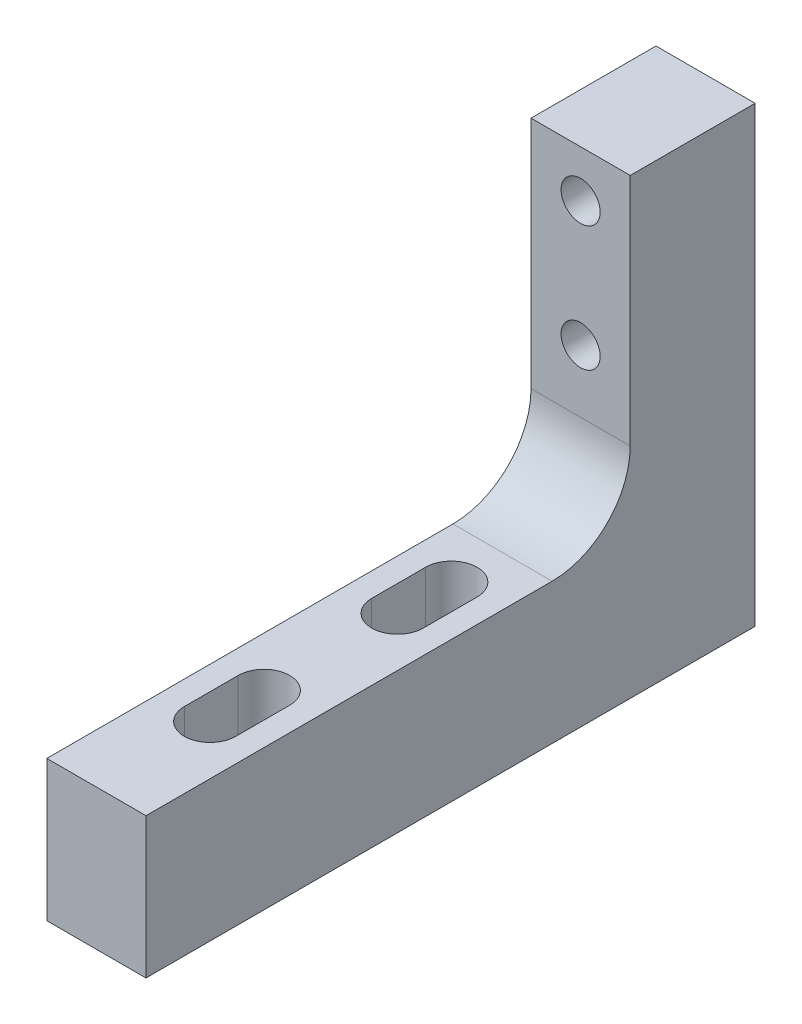
ISO-10303-21;
HEADER;
FILE_DESCRIPTION(('STEP AP214'),'2;1');
FILE_NAME('part.step','',(''),(''),'','','');
FILE_SCHEMA(('AUTOMOTIVE_DESIGN { 1 0 10303 214 1 1 1 1 }'));
ENDSEC;
DATA;
#1=APPLICATION_CONTEXT('core data for automotive mechanical design processes');
#2=APPLICATION_PROTOCOL_DEFINITION('international standard','automotive_design',2000,#1);
#3=PRODUCT_CONTEXT('',#1,'mechanical');
#4=PRODUCT('Part','Part','',(#3));
#5=PRODUCT_RELATED_PRODUCT_CATEGORY('part','',(#4));
#6=PRODUCT_DEFINITION_FORMATION('','',#4);
#7=PRODUCT_DEFINITION_CONTEXT('part definition',#1,'design');
#8=PRODUCT_DEFINITION('design','',#6,#7);
#9=PRODUCT_DEFINITION_SHAPE('','',#8);
#10=(LENGTH_UNIT() NAMED_UNIT(*) SI_UNIT(.MILLI.,.METRE.));
#11=(NAMED_UNIT(*) PLANE_ANGLE_UNIT() SI_UNIT($,.RADIAN.));
#12=(NAMED_UNIT(*) SI_UNIT($,.STERADIAN.) SOLID_ANGLE_UNIT());
#13=UNCERTAINTY_MEASURE_WITH_UNIT(LENGTH_MEASURE(1.E-05),#10,'distance_accuracy_value','');
#14=(GEOMETRIC_REPRESENTATION_CONTEXT(3) GLOBAL_UNCERTAINTY_ASSIGNED_CONTEXT((#13)) GLOBAL_UNIT_ASSIGNED_CONTEXT((#10,
#11,#12)) REPRESENTATION_CONTEXT('',''));
#15=CARTESIAN_POINT('',(0.,0.,0.));
#16=DIRECTION('',(0.,0.,1.));
#17=DIRECTION('',(1.,0.,0.));
#18=AXIS2_PLACEMENT_3D('',#15,#16,#17);
#19=CARTESIAN_POINT('',(6.35,18.,0.));
#20=DIRECTION('',(0.,0.,-1.));
#21=DIRECTION('',(0.,1.,0.));
#22=AXIS2_PLACEMENT_3D('',#19,#20,#21);
#23=PLANE('',#22);
#24=DIRECTION('',(0.,-1.,0.));
#25=VECTOR('',#24,1.);
#26=CARTESIAN_POINT('',(-6.35,18.,0.));
#27=LINE('',#26,#25);
#28=CARTESIAN_POINT('',(-6.35,18.,0.));
#29=VERTEX_POINT('',#28);
#30=CARTESIAN_POINT('',(-6.35,0.,0.));
#31=VERTEX_POINT('',#30);
#32=EDGE_CURVE('E235',#29,#31,#27,.T.);
#33=ORIENTED_EDGE('',*,*,#32,.T.);
#34=DIRECTION('',(-1.,0.,0.));
#35=VECTOR('',#34,1.);
#36=CARTESIAN_POINT('',(6.35,0.,0.));
#37=LINE('',#36,#35);
#38=CARTESIAN_POINT('',(6.35,0.,0.));
#39=VERTEX_POINT('',#38);
#40=EDGE_CURVE('E11',#39,#31,#37,.T.);
#41=ORIENTED_EDGE('',*,*,#40,.F.);
#42=DIRECTION('',(0.,-1.,0.));
#43=VECTOR('',#42,1.);
#44=CARTESIAN_POINT('',(6.35,18.,0.));
#45=LINE('',#44,#43);
#46=CARTESIAN_POINT('',(6.35,18.,0.));
#47=VERTEX_POINT('',#46);
#48=EDGE_CURVE('E236',#47,#39,#45,.T.);
#49=ORIENTED_EDGE('',*,*,#48,.F.);
#50=DIRECTION('',(-1.,0.,0.));
#51=VECTOR('',#50,1.);
#52=CARTESIAN_POINT('',(6.35,18.,0.));
#53=LINE('',#52,#51);
#54=EDGE_CURVE('E252',#47,#29,#53,.T.);
#55=ORIENTED_EDGE('',*,*,#54,.T.);
#56=EDGE_LOOP('',(#33,#41,#49,#55));
#57=FACE_BOUND('',#56,.T.);
#58=ADVANCED_FACE('F40',(#57),#23,.F.);
#59=CARTESIAN_POINT('',(6.35,0.,0.));
#60=DIRECTION('',(0.,1.,0.));
#61=DIRECTION('',(0.,0.,1.));
#62=AXIS2_PLACEMENT_3D('',#59,#60,#61);
#63=PLANE('',#62);
#64=DIRECTION('',(0.,0.,-1.));
#65=VECTOR('',#64,1.);
#66=CARTESIAN_POINT('',(3.3,0.,-21.45));
#67=LINE('',#66,#65);
#68=CARTESIAN_POINT('',(3.30000000000001,0.,-14.55));
#69=VERTEX_POINT('',#68);
#70=CARTESIAN_POINT('',(3.3,0.,-21.45));
#71=VERTEX_POINT('',#70);
#72=EDGE_CURVE('E157',#69,#71,#67,.T.);
#73=ORIENTED_EDGE('',*,*,#72,.T.);
#74=CARTESIAN_POINT('',(0.,0.,-21.45));
#75=DIRECTION('',(0.,1.,0.));
#76=DIRECTION('',(0.,0.,1.));
#77=AXIS2_PLACEMENT_3D('',#74,#75,#76);
#78=CIRCLE('',#77,3.30000000000001);
#79=CARTESIAN_POINT('',(-3.30000000000001,0.,-21.45));
#80=VERTEX_POINT('',#79);
#81=EDGE_CURVE('E151',#71,#80,#78,.T.);
#82=ORIENTED_EDGE('',*,*,#81,.T.);
#83=DIRECTION('',(0.,0.,1.));
#84=VECTOR('',#83,1.);
#85=CARTESIAN_POINT('',(-3.30000000000001,0.,-21.45));
#86=LINE('',#85,#84);
#87=CARTESIAN_POINT('',(-3.3,0.,-14.55));
#88=VERTEX_POINT('',#87);
#89=EDGE_CURVE('E160',#80,#88,#86,.T.);
#90=ORIENTED_EDGE('',*,*,#89,.T.);
#91=CARTESIAN_POINT('',(0.,0.,-14.55));
#92=DIRECTION('',(0.,1.,0.));
#93=DIRECTION('',(0.,0.,1.));
#94=AXIS2_PLACEMENT_3D('',#91,#92,#93);
#95=CIRCLE('',#94,3.30000000000001);
#96=EDGE_CURVE('E54',#88,#69,#95,.T.);
#97=ORIENTED_EDGE('',*,*,#96,.T.);
#98=EDGE_LOOP('',(#73,#82,#90,#97));
#99=FACE_BOUND('',#98,.T.);
#100=DIRECTION('',(0.,0.,-1.));
#101=VECTOR('',#100,1.);
#102=CARTESIAN_POINT('',(3.3,0.,-45.45));
#103=LINE('',#102,#101);
#104=CARTESIAN_POINT('',(3.3,0.,-38.55));
#105=VERTEX_POINT('',#104);
#106=CARTESIAN_POINT('',(3.3,0.,-45.45));
#107=VERTEX_POINT('',#106);
#108=EDGE_CURVE('E196',#105,#107,#103,.T.);
#109=ORIENTED_EDGE('',*,*,#108,.T.);
#110=CARTESIAN_POINT('',(0.,0.,-45.45));
#111=DIRECTION('',(0.,1.,0.));
#112=DIRECTION('',(0.,0.,1.));
#113=AXIS2_PLACEMENT_3D('',#110,#111,#112);
#114=CIRCLE('',#113,3.3);
#115=CARTESIAN_POINT('',(-3.3,0.,-45.45));
#116=VERTEX_POINT('',#115);
#117=EDGE_CURVE('E186',#107,#116,#114,.T.);
#118=ORIENTED_EDGE('',*,*,#117,.T.);
#119=DIRECTION('',(0.,0.,1.));
#120=VECTOR('',#119,1.);
#121=CARTESIAN_POINT('',(-3.3,0.,-45.45));
#122=LINE('',#121,#120);
#123=CARTESIAN_POINT('',(-3.3,0.,-38.55));
#124=VERTEX_POINT('',#123);
#125=EDGE_CURVE('E189',#116,#124,#122,.T.);
#126=ORIENTED_EDGE('',*,*,#125,.T.);
#127=CARTESIAN_POINT('',(0.,0.,-38.55));
#128=DIRECTION('',(0.,1.,0.));
#129=DIRECTION('',(0.,0.,1.));
#130=AXIS2_PLACEMENT_3D('',#127,#128,#129);
#131=CIRCLE('',#130,3.3);
#132=EDGE_CURVE('E193',#124,#105,#131,.T.);
#133=ORIENTED_EDGE('',*,*,#132,.T.);
#134=EDGE_LOOP('',(#109,#118,#126,#133));
#135=FACE_BOUND('',#134,.T.);
#136=DIRECTION('',(0.,0.,-1.));
#137=VECTOR('',#136,1.);
#138=CARTESIAN_POINT('',(-6.35,0.,0.));
#139=LINE('',#138,#137);
#140=CARTESIAN_POINT('',(-6.35,0.,-78.));
#141=VERTEX_POINT('',#140);
#142=EDGE_CURVE('E255',#31,#141,#139,.T.);
#143=ORIENTED_EDGE('',*,*,#142,.T.);
#144=DIRECTION('',(-1.,0.,0.));
#145=VECTOR('',#144,1.);
#146=CARTESIAN_POINT('',(6.35,0.,-78.));
#147=LINE('',#146,#145);
#148=CARTESIAN_POINT('',(6.35,0.,-78.));
#149=VERTEX_POINT('',#148);
#150=EDGE_CURVE('E47',#149,#141,#147,.T.);
#151=ORIENTED_EDGE('',*,*,#150,.F.);
#152=DIRECTION('',(0.,0.,-1.));
#153=VECTOR('',#152,1.);
#154=CARTESIAN_POINT('',(6.35,0.,0.));
#155=LINE('',#154,#153);
#156=EDGE_CURVE('E239',#39,#149,#155,.T.);
#157=ORIENTED_EDGE('',*,*,#156,.F.);
#158=ORIENTED_EDGE('',*,*,#40,.T.);
#159=EDGE_LOOP('',(#143,#151,#157,#158));
#160=FACE_BOUND('',#159,.T.);
#161=ADVANCED_FACE('F164',(#99,#135,#160),#63,.F.);
#162=CARTESIAN_POINT('',(6.35,0.,-78.));
#163=DIRECTION('',(0.,0.,1.));
#164=DIRECTION('',(1.,0.,0.));
#165=AXIS2_PLACEMENT_3D('',#162,#163,#164);
#166=PLANE('',#165);
#167=CARTESIAN_POINT('',(0.,52.,-78.));
#168=DIRECTION('',(0.,0.,-1.));
#169=DIRECTION('',(-1.,0.,0.));
#170=AXIS2_PLACEMENT_3D('',#167,#168,#169);
#171=CIRCLE('',#170,2.49999999999999);
#172=CARTESIAN_POINT('',(-2.49999999999999,52.,-78.));
#173=VERTEX_POINT('',#172);
#174=EDGE_CURVE('E211',#173,#173,#171,.T.);
#175=ORIENTED_EDGE('',*,*,#174,.F.);
#176=EDGE_LOOP('',(#175));
#177=FACE_BOUND('',#176,.T.);
#178=CARTESIAN_POINT('',(0.,9.,-78.));
#179=DIRECTION('',(0.,0.,-1.));
#180=DIRECTION('',(-1.,0.,0.));
#181=AXIS2_PLACEMENT_3D('',#178,#179,#180);
#182=CIRCLE('',#181,2.5);
#183=CARTESIAN_POINT('',(-2.5,9.,-78.));
#184=VERTEX_POINT('',#183);
#185=EDGE_CURVE('E223',#184,#184,#182,.T.);
#186=ORIENTED_EDGE('',*,*,#185,.F.);
#187=EDGE_LOOP('',(#186));
#188=FACE_BOUND('',#187,.T.);
#189=CARTESIAN_POINT('',(0.,36.,-78.));
#190=DIRECTION('',(0.,0.,-1.));
#191=DIRECTION('',(-1.,0.,0.));
#192=AXIS2_PLACEMENT_3D('',#189,#190,#191);
#193=CIRCLE('',#192,2.5);
#194=CARTESIAN_POINT('',(-2.5,36.,-78.));
#195=VERTEX_POINT('',#194);
#196=EDGE_CURVE('E229',#195,#195,#193,.T.);
#197=ORIENTED_EDGE('',*,*,#196,.F.);
#198=EDGE_LOOP('',(#197));
#199=FACE_BOUND('',#198,.T.);
#200=DIRECTION('',(0.,1.,0.));
#201=VECTOR('',#200,1.);
#202=CARTESIAN_POINT('',(-6.35,0.,-78.));
#203=LINE('',#202,#201);
#204=CARTESIAN_POINT('',(-6.35,58.,-78.));
#205=VERTEX_POINT('',#204);
#206=EDGE_CURVE('E257',#141,#205,#203,.T.);
#207=ORIENTED_EDGE('',*,*,#206,.T.);
#208=DIRECTION('',(-1.,0.,0.));
#209=VECTOR('',#208,1.);
#210=CARTESIAN_POINT('',(6.35,58.,-78.));
#211=LINE('',#210,#209);
#212=CARTESIAN_POINT('',(6.35,58.,-78.));
#213=VERTEX_POINT('',#212);
#214=EDGE_CURVE('E277',#213,#205,#211,.T.);
#215=ORIENTED_EDGE('',*,*,#214,.F.);
#216=DIRECTION('',(0.,1.,0.));
#217=VECTOR('',#216,1.);
#218=CARTESIAN_POINT('',(6.35,0.,-78.));
#219=LINE('',#218,#217);
#220=EDGE_CURVE('E242',#149,#213,#219,.T.);
#221=ORIENTED_EDGE('',*,*,#220,.F.);
#222=ORIENTED_EDGE('',*,*,#150,.T.);
#223=EDGE_LOOP('',(#207,#215,#221,#222));
#224=FACE_BOUND('',#223,.T.);
#225=ADVANCED_FACE('F284',(#177,#188,#199,#224),#166,.F.);
#226=CARTESIAN_POINT('',(6.35,58.,-78.));
#227=DIRECTION('',(0.,-1.,0.));
#228=DIRECTION('',(0.,0.,-1.));
#229=AXIS2_PLACEMENT_3D('',#226,#227,#228);
#230=PLANE('',#229);
#231=DIRECTION('',(0.,0.,1.));
#232=VECTOR('',#231,1.);
#233=CARTESIAN_POINT('',(-6.35,58.,-78.));
#234=LINE('',#233,#232);
#235=CARTESIAN_POINT('',(-6.35,58.,-62.));
#236=VERTEX_POINT('',#235);
#237=EDGE_CURVE('E259',#205,#236,#234,.T.);
#238=ORIENTED_EDGE('',*,*,#237,.T.);
#239=DIRECTION('',(-1.,0.,0.));
#240=VECTOR('',#239,1.);
#241=CARTESIAN_POINT('',(6.35,58.,-62.));
#242=LINE('',#241,#240);
#243=CARTESIAN_POINT('',(6.35,58.,-62.));
#244=VERTEX_POINT('',#243);
#245=EDGE_CURVE('E274',#244,#236,#242,.T.);
#246=ORIENTED_EDGE('',*,*,#245,.F.);
#247=DIRECTION('',(0.,0.,1.));
#248=VECTOR('',#247,1.);
#249=CARTESIAN_POINT('',(6.35,58.,-78.));
#250=LINE('',#249,#248);
#251=EDGE_CURVE('E244',#213,#244,#250,.T.);
#252=ORIENTED_EDGE('',*,*,#251,.F.);
#253=ORIENTED_EDGE('',*,*,#214,.T.);
#254=EDGE_LOOP('',(#238,#246,#252,#253));
#255=FACE_BOUND('',#254,.T.);
#256=ADVANCED_FACE('F295',(#255),#230,.F.);
#257=CARTESIAN_POINT('',(6.35,58.,-62.));
#258=DIRECTION('',(0.,0.,-1.));
#259=DIRECTION('',(0.,1.,0.));
#260=AXIS2_PLACEMENT_3D('',#257,#258,#259);
#261=PLANE('',#260);
#262=CARTESIAN_POINT('',(0.,52.,-62.));
#263=DIRECTION('',(0.,0.,-1.));
#264=DIRECTION('',(0.,1.,0.));
#265=AXIS2_PLACEMENT_3D('',#262,#263,#264);
#266=CIRCLE('',#265,2.49999999999999);
#267=CARTESIAN_POINT('',(0.,54.5,-62.));
#268=VERTEX_POINT('',#267);
#269=EDGE_CURVE('E220',#268,#268,#266,.T.);
#270=ORIENTED_EDGE('',*,*,#269,.T.);
#271=EDGE_LOOP('',(#270));
#272=FACE_BOUND('',#271,.T.);
#273=CARTESIAN_POINT('',(0.,36.,-62.));
#274=DIRECTION('',(0.,0.,-1.));
#275=DIRECTION('',(0.,1.,0.));
#276=AXIS2_PLACEMENT_3D('',#273,#274,#275);
#277=CIRCLE('',#276,2.5);
#278=CARTESIAN_POINT('',(0.,38.5,-62.));
#279=VERTEX_POINT('',#278);
#280=EDGE_CURVE('E232',#279,#279,#277,.T.);
#281=ORIENTED_EDGE('',*,*,#280,.T.);
#282=EDGE_LOOP('',(#281));
#283=FACE_BOUND('',#282,.T.);
#284=DIRECTION('',(0.,-1.,0.));
#285=VECTOR('',#284,1.);
#286=CARTESIAN_POINT('',(-6.35,58.,-62.));
#287=LINE('',#286,#285);
#288=CARTESIAN_POINT('',(-6.35,28.,-62.));
#289=VERTEX_POINT('',#288);
#290=EDGE_CURVE('E261',#236,#289,#287,.T.);
#291=ORIENTED_EDGE('',*,*,#290,.T.);
#292=DIRECTION('',(-1.,0.,0.));
#293=VECTOR('',#292,1.);
#294=CARTESIAN_POINT('',(6.35,28.,-62.));
#295=LINE('',#294,#293);
#296=CARTESIAN_POINT('',(6.35,28.,-62.));
#297=VERTEX_POINT('',#296);
#298=EDGE_CURVE('E271',#297,#289,#295,.T.);
#299=ORIENTED_EDGE('',*,*,#298,.F.);
#300=DIRECTION('',(0.,-1.,0.));
#301=VECTOR('',#300,1.);
#302=CARTESIAN_POINT('',(6.35,58.,-62.));
#303=LINE('',#302,#301);
#304=EDGE_CURVE('E246',#244,#297,#303,.T.);
#305=ORIENTED_EDGE('',*,*,#304,.F.);
#306=ORIENTED_EDGE('',*,*,#245,.T.);
#307=EDGE_LOOP('',(#291,#299,#305,#306));
#308=FACE_BOUND('',#307,.T.);
#309=ADVANCED_FACE('F299',(#272,#283,#308),#261,.F.);
#310=CARTESIAN_POINT('',(6.35,28.,-52.));
#311=DIRECTION('',(-1.,0.,0.));
#312=DIRECTION('',(0.,0.,1.));
#313=AXIS2_PLACEMENT_3D('',#310,#311,#312);
#314=CYLINDRICAL_SURFACE('',#313,9.99999999999999);
#315=CARTESIAN_POINT('',(-6.35,28.,-52.));
#316=DIRECTION('',(-1.,0.,0.));
#317=DIRECTION('',(0.,0.,1.));
#318=AXIS2_PLACEMENT_3D('',#315,#316,#317);
#319=CIRCLE('',#318,9.99999999999999);
#320=CARTESIAN_POINT('',(-6.35,18.,-52.));
#321=VERTEX_POINT('',#320);
#322=EDGE_CURVE('E263',#289,#321,#319,.T.);
#323=ORIENTED_EDGE('',*,*,#322,.T.);
#324=DIRECTION('',(-1.,0.,0.));
#325=VECTOR('',#324,1.);
#326=CARTESIAN_POINT('',(6.35,18.,-52.));
#327=LINE('',#326,#325);
#328=CARTESIAN_POINT('',(6.35,18.,-52.));
#329=VERTEX_POINT('',#328);
#330=EDGE_CURVE('E268',#329,#321,#327,.T.);
#331=ORIENTED_EDGE('',*,*,#330,.F.);
#332=CARTESIAN_POINT('',(6.35,28.,-52.));
#333=DIRECTION('',(-1.,0.,0.));
#334=DIRECTION('',(0.,0.,1.));
#335=AXIS2_PLACEMENT_3D('',#332,#333,#334);
#336=CIRCLE('',#335,9.99999999999999);
#337=EDGE_CURVE('E248',#297,#329,#336,.T.);
#338=ORIENTED_EDGE('',*,*,#337,.F.);
#339=ORIENTED_EDGE('',*,*,#298,.T.);
#340=EDGE_LOOP('',(#323,#331,#338,#339));
#341=FACE_BOUND('',#340,.T.);
#342=ADVANCED_FACE('F314',(#341),#314,.F.);
#343=CARTESIAN_POINT('',(6.35,18.,-52.));
#344=DIRECTION('',(0.,-1.,0.));
#345=DIRECTION('',(0.,0.,-1.));
#346=AXIS2_PLACEMENT_3D('',#343,#344,#345);
#347=PLANE('',#346);
#348=DIRECTION('',(0.,0.,1.));
#349=VECTOR('',#348,1.);
#350=CARTESIAN_POINT('',(-3.30000000000001,18.,-21.45));
#351=LINE('',#350,#349);
#352=CARTESIAN_POINT('',(-3.30000000000001,18.,-21.45));
#353=VERTEX_POINT('',#352);
#354=CARTESIAN_POINT('',(-3.3,18.,-14.55));
#355=VERTEX_POINT('',#354);
#356=EDGE_CURVE('E176',#353,#355,#351,.T.);
#357=ORIENTED_EDGE('',*,*,#356,.F.);
#358=CARTESIAN_POINT('',(0.,18.,-21.45));
#359=DIRECTION('',(0.,1.,0.));
#360=DIRECTION('',(0.,0.,1.));
#361=AXIS2_PLACEMENT_3D('',#358,#359,#360);
#362=CIRCLE('',#361,3.30000000000001);
#363=CARTESIAN_POINT('',(3.3,18.,-21.45));
#364=VERTEX_POINT('',#363);
#365=EDGE_CURVE('E62',#364,#353,#362,.T.);
#366=ORIENTED_EDGE('',*,*,#365,.F.);
#367=DIRECTION('',(0.,0.,-1.));
#368=VECTOR('',#367,1.);
#369=CARTESIAN_POINT('',(3.3,18.,-21.45));
#370=LINE('',#369,#368);
#371=CARTESIAN_POINT('',(3.30000000000001,18.,-14.55));
#372=VERTEX_POINT('',#371);
#373=EDGE_CURVE('E167',#372,#364,#370,.T.);
#374=ORIENTED_EDGE('',*,*,#373,.F.);
#375=CARTESIAN_POINT('',(0.,18.,-14.55));
#376=DIRECTION('',(0.,1.,0.));
#377=DIRECTION('',(0.,0.,1.));
#378=AXIS2_PLACEMENT_3D('',#375,#376,#377);
#379=CIRCLE('',#378,3.30000000000001);
#380=EDGE_CURVE('E170',#355,#372,#379,.T.);
#381=ORIENTED_EDGE('',*,*,#380,.F.);
#382=EDGE_LOOP('',(#357,#366,#374,#381));
#383=FACE_BOUND('',#382,.T.);
#384=DIRECTION('',(0.,0.,1.));
#385=VECTOR('',#384,1.);
#386=CARTESIAN_POINT('',(-3.3,18.,-45.45));
#387=LINE('',#386,#385);
#388=CARTESIAN_POINT('',(-3.3,18.,-45.45));
#389=VERTEX_POINT('',#388);
#390=CARTESIAN_POINT('',(-3.3,18.,-38.55));
#391=VERTEX_POINT('',#390);
#392=EDGE_CURVE('E201',#389,#391,#387,.T.);
#393=ORIENTED_EDGE('',*,*,#392,.F.);
#394=CARTESIAN_POINT('',(0.,18.,-45.45));
#395=DIRECTION('',(0.,1.,0.));
#396=DIRECTION('',(0.,0.,1.));
#397=AXIS2_PLACEMENT_3D('',#394,#395,#396);
#398=CIRCLE('',#397,3.3);
#399=CARTESIAN_POINT('',(3.3,18.,-45.45));
#400=VERTEX_POINT('',#399);
#401=EDGE_CURVE('E182',#400,#389,#398,.T.);
#402=ORIENTED_EDGE('',*,*,#401,.F.);
#403=DIRECTION('',(0.,0.,-1.));
#404=VECTOR('',#403,1.);
#405=CARTESIAN_POINT('',(3.3,18.,-45.45));
#406=LINE('',#405,#404);
#407=CARTESIAN_POINT('',(3.3,18.,-38.55));
#408=VERTEX_POINT('',#407);
#409=EDGE_CURVE('E190',#408,#400,#406,.T.);
#410=ORIENTED_EDGE('',*,*,#409,.F.);
#411=CARTESIAN_POINT('',(0.,18.,-38.55));
#412=DIRECTION('',(0.,1.,0.));
#413=DIRECTION('',(0.,0.,1.));
#414=AXIS2_PLACEMENT_3D('',#411,#412,#413);
#415=CIRCLE('',#414,3.3);
#416=EDGE_CURVE('E204',#391,#408,#415,.T.);
#417=ORIENTED_EDGE('',*,*,#416,.F.);
#418=EDGE_LOOP('',(#393,#402,#410,#417));
#419=FACE_BOUND('',#418,.T.);
#420=DIRECTION('',(0.,0.,1.));
#421=VECTOR('',#420,1.);
#422=CARTESIAN_POINT('',(-6.35,18.,-52.));
#423=LINE('',#422,#421);
#424=EDGE_CURVE('E240',#321,#29,#423,.T.);
#425=ORIENTED_EDGE('',*,*,#424,.T.);
#426=ORIENTED_EDGE('',*,*,#54,.F.);
#427=DIRECTION('',(0.,0.,1.));
#428=VECTOR('',#427,1.);
#429=CARTESIAN_POINT('',(6.35,18.,-52.));
#430=LINE('',#429,#428);
#431=EDGE_CURVE('E250',#329,#47,#430,.T.);
#432=ORIENTED_EDGE('',*,*,#431,.F.);
#433=ORIENTED_EDGE('',*,*,#330,.T.);
#434=EDGE_LOOP('',(#425,#426,#432,#433));
#435=FACE_BOUND('',#434,.T.);
#436=ADVANCED_FACE('F311',(#383,#419,#435),#347,.F.);
#437=CARTESIAN_POINT('',(6.35,28.,-52.));
#438=DIRECTION('',(-1.,0.,0.));
#439=DIRECTION('',(0.,0.,1.));
#440=AXIS2_PLACEMENT_3D('',#437,#438,#439);
#441=PLANE('',#440);
#442=ORIENTED_EDGE('',*,*,#48,.T.);
#443=ORIENTED_EDGE('',*,*,#156,.T.);
#444=ORIENTED_EDGE('',*,*,#220,.T.);
#445=ORIENTED_EDGE('',*,*,#251,.T.);
#446=ORIENTED_EDGE('',*,*,#304,.T.);
#447=ORIENTED_EDGE('',*,*,#337,.T.);
#448=ORIENTED_EDGE('',*,*,#431,.T.);
#449=EDGE_LOOP('',(#442,#443,#444,#445,#446,#447,#448));
#450=FACE_BOUND('',#449,.T.);
#451=ADVANCED_FACE('F303',(#450),#441,.F.);
#452=CARTESIAN_POINT('',(-6.35,28.,-52.));
#453=DIRECTION('',(-1.,0.,0.));
#454=DIRECTION('',(0.,0.,1.));
#455=AXIS2_PLACEMENT_3D('',#452,#453,#454);
#456=PLANE('',#455);
#457=ORIENTED_EDGE('',*,*,#32,.F.);
#458=ORIENTED_EDGE('',*,*,#424,.F.);
#459=ORIENTED_EDGE('',*,*,#322,.F.);
#460=ORIENTED_EDGE('',*,*,#290,.F.);
#461=ORIENTED_EDGE('',*,*,#237,.F.);
#462=ORIENTED_EDGE('',*,*,#206,.F.);
#463=ORIENTED_EDGE('',*,*,#142,.F.);
#464=EDGE_LOOP('',(#457,#458,#459,#460,#461,#462,#463));
#465=FACE_BOUND('',#464,.T.);
#466=ADVANCED_FACE('F290',(#465),#456,.T.);
#467=CARTESIAN_POINT('',(0.,36.,-78.));
#468=DIRECTION('',(0.,0.,-1.));
#469=DIRECTION('',(-1.,0.,0.));
#470=AXIS2_PLACEMENT_3D('',#467,#468,#469);
#471=CYLINDRICAL_SURFACE('',#470,2.5);
#472=ORIENTED_EDGE('',*,*,#196,.T.);
#473=EDGE_LOOP('',(#472));
#474=FACE_BOUND('',#473,.T.);
#475=ORIENTED_EDGE('',*,*,#280,.F.);
#476=EDGE_LOOP('',(#475));
#477=FACE_BOUND('',#476,.T.);
#478=ADVANCED_FACE('F461',(#474,#477),#471,.F.);
#479=CARTESIAN_POINT('',(0.,9.,-52.6));
#480=DIRECTION('',(0.,0.,-1.));
#481=DIRECTION('',(-1.,0.,0.));
#482=AXIS2_PLACEMENT_3D('',#479,#480,#481);
#483=CONICAL_SURFACE('',#482,2.49999999999999,1.02974425867665);
#484=CARTESIAN_POINT('',(0.,9.,-51.0978484524311));
#485=VERTEX_POINT('',#484);
#486=VERTEX_LOOP('',#485);
#487=FACE_BOUND('',#486,.T.);
#488=CARTESIAN_POINT('',(0.,9.,-52.6));
#489=DIRECTION('',(0.,0.,-1.));
#490=DIRECTION('',(-1.,0.,0.));
#491=AXIS2_PLACEMENT_3D('',#488,#489,#490);
#492=CIRCLE('',#491,2.49999999999999);
#493=CARTESIAN_POINT('',(-2.49999999999999,9.,-52.6));
#494=VERTEX_POINT('',#493);
#495=EDGE_CURVE('E226',#494,#494,#492,.T.);
#496=ORIENTED_EDGE('',*,*,#495,.T.);
#497=EDGE_LOOP('',(#496));
#498=FACE_BOUND('',#497,.T.);
#499=ADVANCED_FACE('F457',(#487,#498),#483,.F.);
#500=CARTESIAN_POINT('',(0.,9.,-78.));
#501=DIRECTION('',(0.,0.,-1.));
#502=DIRECTION('',(-1.,0.,0.));
#503=AXIS2_PLACEMENT_3D('',#500,#501,#502);
#504=CYLINDRICAL_SURFACE('',#503,2.5);
#505=ORIENTED_EDGE('',*,*,#495,.F.);
#506=EDGE_LOOP('',(#505));
#507=FACE_BOUND('',#506,.T.);
#508=ORIENTED_EDGE('',*,*,#185,.T.);
#509=EDGE_LOOP('',(#508));
#510=FACE_BOUND('',#509,.T.);
#511=ADVANCED_FACE('F359',(#507,#510),#504,.F.);
#512=CARTESIAN_POINT('',(0.,52.,-78.));
#513=DIRECTION('',(0.,0.,-1.));
#514=DIRECTION('',(-1.,0.,0.));
#515=AXIS2_PLACEMENT_3D('',#512,#513,#514);
#516=CYLINDRICAL_SURFACE('',#515,2.49999999999999);
#517=ORIENTED_EDGE('',*,*,#174,.T.);
#518=EDGE_LOOP('',(#517));
#519=FACE_BOUND('',#518,.T.);
#520=ORIENTED_EDGE('',*,*,#269,.F.);
#521=EDGE_LOOP('',(#520));
#522=FACE_BOUND('',#521,.T.);
#523=ADVANCED_FACE('F353',(#519,#522),#516,.F.);
#524=CARTESIAN_POINT('',(0.,0.,-45.45));
#525=DIRECTION('',(0.,1.,0.));
#526=DIRECTION('',(0.,0.,1.));
#527=AXIS2_PLACEMENT_3D('',#524,#525,#526);
#528=CYLINDRICAL_SURFACE('',#527,3.3);
#529=ORIENTED_EDGE('',*,*,#401,.T.);
#530=DIRECTION('',(0.,1.,0.));
#531=VECTOR('',#530,1.);
#532=CARTESIAN_POINT('',(-3.3,0.,-45.45));
#533=LINE('',#532,#531);
#534=EDGE_CURVE('E199',#116,#389,#533,.T.);
#535=ORIENTED_EDGE('',*,*,#534,.F.);
#536=ORIENTED_EDGE('',*,*,#117,.F.);
#537=DIRECTION('',(0.,1.,0.));
#538=VECTOR('',#537,1.);
#539=CARTESIAN_POINT('',(3.3,0.,-45.45));
#540=LINE('',#539,#538);
#541=EDGE_CURVE('E209',#107,#400,#540,.T.);
#542=ORIENTED_EDGE('',*,*,#541,.T.);
#543=EDGE_LOOP('',(#529,#535,#536,#542));
#544=FACE_BOUND('',#543,.T.);
#545=ADVANCED_FACE('F358',(#544),#528,.F.);
#546=CARTESIAN_POINT('',(3.3,0.,-45.45));
#547=DIRECTION('',(1.,0.,0.));
#548=DIRECTION('',(0.,0.,-1.));
#549=AXIS2_PLACEMENT_3D('',#546,#547,#548);
#550=PLANE('',#549);
#551=ORIENTED_EDGE('',*,*,#409,.T.);
#552=ORIENTED_EDGE('',*,*,#541,.F.);
#553=ORIENTED_EDGE('',*,*,#108,.F.);
#554=DIRECTION('',(0.,1.,0.));
#555=VECTOR('',#554,1.);
#556=CARTESIAN_POINT('',(3.3,0.,-38.55));
#557=LINE('',#556,#555);
#558=EDGE_CURVE('E212',#105,#408,#557,.T.);
#559=ORIENTED_EDGE('',*,*,#558,.T.);
#560=EDGE_LOOP('',(#551,#552,#553,#559));
#561=FACE_BOUND('',#560,.T.);
#562=ADVANCED_FACE('F385',(#561),#550,.F.);
#563=CARTESIAN_POINT('',(0.,0.,-38.55));
#564=DIRECTION('',(0.,1.,0.));
#565=DIRECTION('',(0.,0.,1.));
#566=AXIS2_PLACEMENT_3D('',#563,#564,#565);
#567=CYLINDRICAL_SURFACE('',#566,3.3);
#568=ORIENTED_EDGE('',*,*,#416,.T.);
#569=ORIENTED_EDGE('',*,*,#558,.F.);
#570=ORIENTED_EDGE('',*,*,#132,.F.);
#571=DIRECTION('',(0.,1.,0.));
#572=VECTOR('',#571,1.);
#573=CARTESIAN_POINT('',(-3.3,0.,-38.55));
#574=LINE('',#573,#572);
#575=EDGE_CURVE('E214',#124,#391,#574,.T.);
#576=ORIENTED_EDGE('',*,*,#575,.T.);
#577=EDGE_LOOP('',(#568,#569,#570,#576));
#578=FACE_BOUND('',#577,.T.);
#579=ADVANCED_FACE('F395',(#578),#567,.F.);
#580=CARTESIAN_POINT('',(-3.3,0.,-45.45));
#581=DIRECTION('',(-1.,0.,0.));
#582=DIRECTION('',(0.,0.,1.));
#583=AXIS2_PLACEMENT_3D('',#580,#581,#582);
#584=PLANE('',#583);
#585=ORIENTED_EDGE('',*,*,#392,.T.);
#586=ORIENTED_EDGE('',*,*,#575,.F.);
#587=ORIENTED_EDGE('',*,*,#125,.F.);
#588=ORIENTED_EDGE('',*,*,#534,.T.);
#589=EDGE_LOOP('',(#585,#586,#587,#588));
#590=FACE_BOUND('',#589,.T.);
#591=ADVANCED_FACE('F405',(#590),#584,.F.);
#592=CARTESIAN_POINT('',(0.,0.,-21.45));
#593=DIRECTION('',(0.,1.,0.));
#594=DIRECTION('',(0.,0.,1.));
#595=AXIS2_PLACEMENT_3D('',#592,#593,#594);
#596=CYLINDRICAL_SURFACE('',#595,3.30000000000001);
#597=ORIENTED_EDGE('',*,*,#365,.T.);
#598=DIRECTION('',(0.,1.,0.));
#599=VECTOR('',#598,1.);
#600=CARTESIAN_POINT('',(-3.30000000000001,0.,-21.45));
#601=LINE('',#600,#599);
#602=EDGE_CURVE('E147',#80,#353,#601,.T.);
#603=ORIENTED_EDGE('',*,*,#602,.F.);
#604=ORIENTED_EDGE('',*,*,#81,.F.);
#605=DIRECTION('',(0.,1.,0.));
#606=VECTOR('',#605,1.);
#607=CARTESIAN_POINT('',(3.3,0.,-21.45));
#608=LINE('',#607,#606);
#609=EDGE_CURVE('E180',#71,#364,#608,.T.);
#610=ORIENTED_EDGE('',*,*,#609,.T.);
#611=EDGE_LOOP('',(#597,#603,#604,#610));
#612=FACE_BOUND('',#611,.T.);
#613=ADVANCED_FACE('F149',(#612),#596,.F.);
#614=CARTESIAN_POINT('',(3.3,0.,-21.45));
#615=DIRECTION('',(1.,0.,0.));
#616=DIRECTION('',(0.,0.,-1.));
#617=AXIS2_PLACEMENT_3D('',#614,#615,#616);
#618=PLANE('',#617);
#619=ORIENTED_EDGE('',*,*,#373,.T.);
#620=ORIENTED_EDGE('',*,*,#609,.F.);
#621=ORIENTED_EDGE('',*,*,#72,.F.);
#622=DIRECTION('',(0.,1.,0.));
#623=VECTOR('',#622,1.);
#624=CARTESIAN_POINT('',(3.30000000000001,0.,-14.55));
#625=LINE('',#624,#623);
#626=EDGE_CURVE('E183',#69,#372,#625,.T.);
#627=ORIENTED_EDGE('',*,*,#626,.T.);
#628=EDGE_LOOP('',(#619,#620,#621,#627));
#629=FACE_BOUND('',#628,.T.);
#630=ADVANCED_FACE('F424',(#629),#618,.F.);
#631=CARTESIAN_POINT('',(0.,0.,-14.55));
#632=DIRECTION('',(0.,1.,0.));
#633=DIRECTION('',(0.,0.,1.));
#634=AXIS2_PLACEMENT_3D('',#631,#632,#633);
#635=CYLINDRICAL_SURFACE('',#634,3.30000000000001);
#636=ORIENTED_EDGE('',*,*,#380,.T.);
#637=ORIENTED_EDGE('',*,*,#626,.F.);
#638=ORIENTED_EDGE('',*,*,#96,.F.);
#639=DIRECTION('',(0.,1.,0.));
#640=VECTOR('',#639,1.);
#641=CARTESIAN_POINT('',(-3.3,0.,-14.55));
#642=LINE('',#641,#640);
#643=EDGE_CURVE('E156',#88,#355,#642,.T.);
#644=ORIENTED_EDGE('',*,*,#643,.T.);
#645=EDGE_LOOP('',(#636,#637,#638,#644));
#646=FACE_BOUND('',#645,.T.);
#647=ADVANCED_FACE('F433',(#646),#635,.F.);
#648=CARTESIAN_POINT('',(-3.30000000000001,0.,-21.45));
#649=DIRECTION('',(-1.,0.,0.));
#650=DIRECTION('',(0.,0.,1.));
#651=AXIS2_PLACEMENT_3D('',#648,#649,#650);
#652=PLANE('',#651);
#653=ORIENTED_EDGE('',*,*,#356,.T.);
#654=ORIENTED_EDGE('',*,*,#643,.F.);
#655=ORIENTED_EDGE('',*,*,#89,.F.);
#656=ORIENTED_EDGE('',*,*,#602,.T.);
#657=EDGE_LOOP('',(#653,#654,#655,#656));
#658=FACE_BOUND('',#657,.T.);
#659=ADVANCED_FACE('F161',(#658),#652,.F.);
#660=CLOSED_SHELL('',(#58,#161,#225,#256,#309,#342,#436,#451,#466,#478,#499,#511,#523,#545,#562,
#579,#591,#613,#630,#647,#659));
#661=MANIFOLD_SOLID_BREP('B2',#660);
#662=ADVANCED_BREP_SHAPE_REPRESENTATION('',(#18,#661),#14);
#663=SHAPE_DEFINITION_REPRESENTATION(#9,#662);
ENDSEC;
END-ISO-10303-21;
